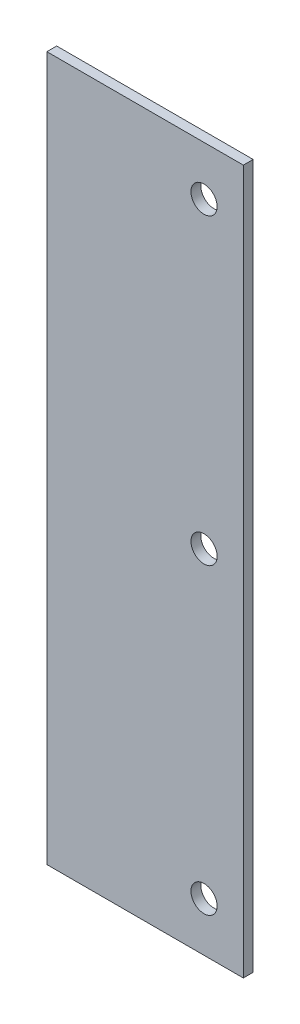
ISO-10303-21;
HEADER;
FILE_DESCRIPTION(('STEP AP214'),'2;1');
FILE_NAME('part.step','',(''),(''),'','','');
FILE_SCHEMA(('AUTOMOTIVE_DESIGN { 1 0 10303 214 1 1 1 1 }'));
ENDSEC;
DATA;
#1=APPLICATION_CONTEXT('core data for automotive mechanical design processes');
#2=APPLICATION_PROTOCOL_DEFINITION('international standard','automotive_design',2000,#1);
#3=PRODUCT_CONTEXT('',#1,'mechanical');
#4=PRODUCT('Part','Part','',(#3));
#5=PRODUCT_RELATED_PRODUCT_CATEGORY('part','',(#4));
#6=PRODUCT_DEFINITION_FORMATION('','',#4);
#7=PRODUCT_DEFINITION_CONTEXT('part definition',#1,'design');
#8=PRODUCT_DEFINITION('design','',#6,#7);
#9=PRODUCT_DEFINITION_SHAPE('','',#8);
#10=(LENGTH_UNIT() NAMED_UNIT(*) SI_UNIT(.MILLI.,.METRE.));
#11=(NAMED_UNIT(*) PLANE_ANGLE_UNIT() SI_UNIT($,.RADIAN.));
#12=(NAMED_UNIT(*) SI_UNIT($,.STERADIAN.) SOLID_ANGLE_UNIT());
#13=UNCERTAINTY_MEASURE_WITH_UNIT(LENGTH_MEASURE(1.E-05),#10,'distance_accuracy_value','');
#14=(GEOMETRIC_REPRESENTATION_CONTEXT(3) GLOBAL_UNCERTAINTY_ASSIGNED_CONTEXT((#13)) GLOBAL_UNIT_ASSIGNED_CONTEXT((#10,
#11,#12)) REPRESENTATION_CONTEXT('',''));
#15=CARTESIAN_POINT('',(0.,0.,0.));
#16=DIRECTION('',(0.,0.,1.));
#17=DIRECTION('',(1.,0.,0.));
#18=AXIS2_PLACEMENT_3D('',#15,#16,#17);
#19=CARTESIAN_POINT('',(0.,0.,3.));
#20=DIRECTION('',(0.,0.,-1.));
#21=DIRECTION('',(-1.,0.,0.));
#22=AXIS2_PLACEMENT_3D('',#19,#20,#21);
#23=PLANE('',#22);
#24=DIRECTION('',(0.,1.,0.));
#25=VECTOR('',#24,1.);
#26=CARTESIAN_POINT('',(60.,215.,3.));
#27=LINE('',#26,#25);
#28=CARTESIAN_POINT('',(60.,0.,3.));
#29=VERTEX_POINT('',#28);
#30=CARTESIAN_POINT('',(60.,215.,3.));
#31=VERTEX_POINT('',#30);
#32=EDGE_CURVE('E92',#29,#31,#27,.T.);
#33=ORIENTED_EDGE('',*,*,#32,.T.);
#34=DIRECTION('',(-1.,0.,0.));
#35=VECTOR('',#34,1.);
#36=CARTESIAN_POINT('',(60.,215.,3.));
#37=LINE('',#36,#35);
#38=CARTESIAN_POINT('',(0.,215.,3.));
#39=VERTEX_POINT('',#38);
#40=EDGE_CURVE('E87',#31,#39,#37,.T.);
#41=ORIENTED_EDGE('',*,*,#40,.T.);
#42=DIRECTION('',(0.,-1.,0.));
#43=VECTOR('',#42,1.);
#44=CARTESIAN_POINT('',(0.,215.,3.));
#45=LINE('',#44,#43);
#46=CARTESIAN_POINT('',(0.,0.,3.));
#47=VERTEX_POINT('',#46);
#48=EDGE_CURVE('E90',#39,#47,#45,.T.);
#49=ORIENTED_EDGE('',*,*,#48,.T.);
#50=DIRECTION('',(1.,0.,0.));
#51=VECTOR('',#50,1.);
#52=CARTESIAN_POINT('',(60.,0.,3.));
#53=LINE('',#52,#51);
#54=EDGE_CURVE('E57',#47,#29,#53,.T.);
#55=ORIENTED_EDGE('',*,*,#54,.T.);
#56=EDGE_LOOP('',(#33,#41,#49,#55));
#57=FACE_BOUND('',#56,.T.);
#58=CARTESIAN_POINT('',(48.,15.,3.));
#59=DIRECTION('',(0.,0.,1.));
#60=DIRECTION('',(1.,0.,0.));
#61=AXIS2_PLACEMENT_3D('',#58,#59,#60);
#62=CIRCLE('',#61,3.99999999999999);
#63=CARTESIAN_POINT('',(52.,15.,3.));
#64=VERTEX_POINT('',#63);
#65=EDGE_CURVE('E112',#64,#64,#62,.T.);
#66=ORIENTED_EDGE('',*,*,#65,.F.);
#67=EDGE_LOOP('',(#66));
#68=FACE_BOUND('',#67,.T.);
#69=CARTESIAN_POINT('',(48.,107.5,3.));
#70=DIRECTION('',(0.,0.,1.));
#71=DIRECTION('',(1.,0.,0.));
#72=AXIS2_PLACEMENT_3D('',#69,#70,#71);
#73=CIRCLE('',#72,3.99999999999999);
#74=CARTESIAN_POINT('',(52.,107.5,3.));
#75=VERTEX_POINT('',#74);
#76=EDGE_CURVE('E134',#75,#75,#73,.T.);
#77=ORIENTED_EDGE('',*,*,#76,.F.);
#78=EDGE_LOOP('',(#77));
#79=FACE_BOUND('',#78,.T.);
#80=CARTESIAN_POINT('',(48.,200.,3.));
#81=DIRECTION('',(0.,0.,1.));
#82=DIRECTION('',(1.,0.,0.));
#83=AXIS2_PLACEMENT_3D('',#80,#81,#82);
#84=CIRCLE('',#83,3.99999999999999);
#85=CARTESIAN_POINT('',(52.,200.,3.));
#86=VERTEX_POINT('',#85);
#87=EDGE_CURVE('E142',#86,#86,#84,.T.);
#88=ORIENTED_EDGE('',*,*,#87,.F.);
#89=EDGE_LOOP('',(#88));
#90=FACE_BOUND('',#89,.T.);
#91=ADVANCED_FACE('F39',(#57,#68,#79,#90),#23,.F.);
#92=CARTESIAN_POINT('',(0.,0.,0.));
#93=DIRECTION('',(0.,0.,-1.));
#94=DIRECTION('',(-1.,0.,0.));
#95=AXIS2_PLACEMENT_3D('',#92,#93,#94);
#96=PLANE('',#95);
#97=CARTESIAN_POINT('',(48.,107.5,0.));
#98=DIRECTION('',(0.,0.,1.));
#99=DIRECTION('',(1.,0.,0.));
#100=AXIS2_PLACEMENT_3D('',#97,#98,#99);
#101=CIRCLE('',#100,3.99999999999999);
#102=CARTESIAN_POINT('',(52.,107.5,0.));
#103=VERTEX_POINT('',#102);
#104=EDGE_CURVE('E138',#103,#103,#101,.T.);
#105=ORIENTED_EDGE('',*,*,#104,.T.);
#106=EDGE_LOOP('',(#105));
#107=FACE_BOUND('',#106,.T.);
#108=DIRECTION('',(0.,1.,0.));
#109=VECTOR('',#108,1.);
#110=CARTESIAN_POINT('',(60.,215.,0.));
#111=LINE('',#110,#109);
#112=CARTESIAN_POINT('',(60.,0.,0.));
#113=VERTEX_POINT('',#112);
#114=CARTESIAN_POINT('',(60.,215.,0.));
#115=VERTEX_POINT('',#114);
#116=EDGE_CURVE('E108',#113,#115,#111,.T.);
#117=ORIENTED_EDGE('',*,*,#116,.F.);
#118=DIRECTION('',(1.,0.,0.));
#119=VECTOR('',#118,1.);
#120=CARTESIAN_POINT('',(60.,0.,0.));
#121=LINE('',#120,#119);
#122=CARTESIAN_POINT('',(0.,0.,0.));
#123=VERTEX_POINT('',#122);
#124=EDGE_CURVE('E80',#123,#113,#121,.T.);
#125=ORIENTED_EDGE('',*,*,#124,.F.);
#126=DIRECTION('',(0.,-1.,0.));
#127=VECTOR('',#126,1.);
#128=CARTESIAN_POINT('',(0.,215.,0.));
#129=LINE('',#128,#127);
#130=CARTESIAN_POINT('',(0.,215.,0.));
#131=VERTEX_POINT('',#130);
#132=EDGE_CURVE('E74',#131,#123,#129,.T.);
#133=ORIENTED_EDGE('',*,*,#132,.F.);
#134=DIRECTION('',(-1.,0.,0.));
#135=VECTOR('',#134,1.);
#136=CARTESIAN_POINT('',(60.,215.,0.));
#137=LINE('',#136,#135);
#138=EDGE_CURVE('E97',#115,#131,#137,.T.);
#139=ORIENTED_EDGE('',*,*,#138,.F.);
#140=EDGE_LOOP('',(#117,#125,#133,#139));
#141=FACE_BOUND('',#140,.T.);
#142=CARTESIAN_POINT('',(48.,15.,0.));
#143=DIRECTION('',(0.,0.,1.));
#144=DIRECTION('',(1.,0.,0.));
#145=AXIS2_PLACEMENT_3D('',#142,#143,#144);
#146=CIRCLE('',#145,3.99999999999999);
#147=CARTESIAN_POINT('',(52.,15.,0.));
#148=VERTEX_POINT('',#147);
#149=EDGE_CURVE('E130',#148,#148,#146,.T.);
#150=ORIENTED_EDGE('',*,*,#149,.T.);
#151=EDGE_LOOP('',(#150));
#152=FACE_BOUND('',#151,.T.);
#153=CARTESIAN_POINT('',(48.,200.,0.));
#154=DIRECTION('',(0.,0.,1.));
#155=DIRECTION('',(1.,0.,0.));
#156=AXIS2_PLACEMENT_3D('',#153,#154,#155);
#157=CIRCLE('',#156,3.99999999999999);
#158=CARTESIAN_POINT('',(52.,200.,0.));
#159=VERTEX_POINT('',#158);
#160=EDGE_CURVE('E146',#159,#159,#157,.T.);
#161=ORIENTED_EDGE('',*,*,#160,.T.);
#162=EDGE_LOOP('',(#161));
#163=FACE_BOUND('',#162,.T.);
#164=ADVANCED_FACE('F125',(#107,#141,#152,#163),#96,.T.);
#165=CARTESIAN_POINT('',(60.,215.,3.));
#166=DIRECTION('',(-1.,0.,0.));
#167=DIRECTION('',(0.,-1.,0.));
#168=AXIS2_PLACEMENT_3D('',#165,#166,#167);
#169=PLANE('',#168);
#170=ORIENTED_EDGE('',*,*,#116,.T.);
#171=DIRECTION('',(0.,0.,-1.));
#172=VECTOR('',#171,1.);
#173=CARTESIAN_POINT('',(60.,215.,3.));
#174=LINE('',#173,#172);
#175=EDGE_CURVE('E11',#31,#115,#174,.T.);
#176=ORIENTED_EDGE('',*,*,#175,.F.);
#177=ORIENTED_EDGE('',*,*,#32,.F.);
#178=DIRECTION('',(0.,0.,-1.));
#179=VECTOR('',#178,1.);
#180=CARTESIAN_POINT('',(60.,0.,3.));
#181=LINE('',#180,#179);
#182=EDGE_CURVE('E104',#29,#113,#181,.T.);
#183=ORIENTED_EDGE('',*,*,#182,.T.);
#184=EDGE_LOOP('',(#170,#176,#177,#183));
#185=FACE_BOUND('',#184,.T.);
#186=ADVANCED_FACE('F41',(#185),#169,.F.);
#187=CARTESIAN_POINT('',(60.,215.,3.));
#188=DIRECTION('',(0.,-1.,0.));
#189=DIRECTION('',(0.,0.,-1.));
#190=AXIS2_PLACEMENT_3D('',#187,#188,#189);
#191=PLANE('',#190);
#192=ORIENTED_EDGE('',*,*,#138,.T.);
#193=DIRECTION('',(0.,0.,-1.));
#194=VECTOR('',#193,1.);
#195=CARTESIAN_POINT('',(0.,215.,3.));
#196=LINE('',#195,#194);
#197=EDGE_CURVE('E49',#39,#131,#196,.T.);
#198=ORIENTED_EDGE('',*,*,#197,.F.);
#199=ORIENTED_EDGE('',*,*,#40,.F.);
#200=ORIENTED_EDGE('',*,*,#175,.T.);
#201=EDGE_LOOP('',(#192,#198,#199,#200));
#202=FACE_BOUND('',#201,.T.);
#203=ADVANCED_FACE('F96',(#202),#191,.F.);
#204=CARTESIAN_POINT('',(0.,215.,3.));
#205=DIRECTION('',(1.,0.,0.));
#206=DIRECTION('',(0.,0.,-1.));
#207=AXIS2_PLACEMENT_3D('',#204,#205,#206);
#208=PLANE('',#207);
#209=ORIENTED_EDGE('',*,*,#132,.T.);
#210=DIRECTION('',(0.,0.,-1.));
#211=VECTOR('',#210,1.);
#212=CARTESIAN_POINT('',(0.,0.,3.));
#213=LINE('',#212,#211);
#214=EDGE_CURVE('E99',#47,#123,#213,.T.);
#215=ORIENTED_EDGE('',*,*,#214,.F.);
#216=ORIENTED_EDGE('',*,*,#48,.F.);
#217=ORIENTED_EDGE('',*,*,#197,.T.);
#218=EDGE_LOOP('',(#209,#215,#216,#217));
#219=FACE_BOUND('',#218,.T.);
#220=ADVANCED_FACE('F100',(#219),#208,.F.);
#221=CARTESIAN_POINT('',(60.,0.,3.));
#222=DIRECTION('',(0.,1.,0.));
#223=DIRECTION('',(-1.,0.,0.));
#224=AXIS2_PLACEMENT_3D('',#221,#222,#223);
#225=PLANE('',#224);
#226=ORIENTED_EDGE('',*,*,#124,.T.);
#227=ORIENTED_EDGE('',*,*,#182,.F.);
#228=ORIENTED_EDGE('',*,*,#54,.F.);
#229=ORIENTED_EDGE('',*,*,#214,.T.);
#230=EDGE_LOOP('',(#226,#227,#228,#229));
#231=FACE_BOUND('',#230,.T.);
#232=ADVANCED_FACE('F122',(#231),#225,.F.);
#233=CARTESIAN_POINT('',(48.,15.,3.));
#234=DIRECTION('',(0.,0.,-1.));
#235=DIRECTION('',(-1.,0.,0.));
#236=AXIS2_PLACEMENT_3D('',#233,#234,#235);
#237=CYLINDRICAL_SURFACE('',#236,3.99999999999999);
#238=ORIENTED_EDGE('',*,*,#65,.T.);
#239=EDGE_LOOP('',(#238));
#240=FACE_BOUND('',#239,.T.);
#241=ORIENTED_EDGE('',*,*,#149,.F.);
#242=EDGE_LOOP('',(#241));
#243=FACE_BOUND('',#242,.T.);
#244=ADVANCED_FACE('F165',(#240,#243),#237,.F.);
#245=CARTESIAN_POINT('',(48.,107.5,3.));
#246=DIRECTION('',(0.,0.,-1.));
#247=DIRECTION('',(-1.,0.,0.));
#248=AXIS2_PLACEMENT_3D('',#245,#246,#247);
#249=CYLINDRICAL_SURFACE('',#248,3.99999999999999);
#250=ORIENTED_EDGE('',*,*,#76,.T.);
#251=EDGE_LOOP('',(#250));
#252=FACE_BOUND('',#251,.T.);
#253=ORIENTED_EDGE('',*,*,#104,.F.);
#254=EDGE_LOOP('',(#253));
#255=FACE_BOUND('',#254,.T.);
#256=ADVANCED_FACE('F211',(#252,#255),#249,.F.);
#257=CARTESIAN_POINT('',(48.,200.,3.));
#258=DIRECTION('',(0.,0.,-1.));
#259=DIRECTION('',(-1.,0.,0.));
#260=AXIS2_PLACEMENT_3D('',#257,#258,#259);
#261=CYLINDRICAL_SURFACE('',#260,3.99999999999999);
#262=ORIENTED_EDGE('',*,*,#87,.T.);
#263=EDGE_LOOP('',(#262));
#264=FACE_BOUND('',#263,.T.);
#265=ORIENTED_EDGE('',*,*,#160,.F.);
#266=EDGE_LOOP('',(#265));
#267=FACE_BOUND('',#266,.T.);
#268=ADVANCED_FACE('F154',(#264,#267),#261,.F.);
#269=CLOSED_SHELL('',(#91,#164,#186,#203,#220,#232,#244,#256,#268));
#270=MANIFOLD_SOLID_BREP('B2',#269);
#271=ADVANCED_BREP_SHAPE_REPRESENTATION('',(#18,#270),#14);
#272=SHAPE_DEFINITION_REPRESENTATION(#9,#271);
ENDSEC;
END-ISO-10303-21;
